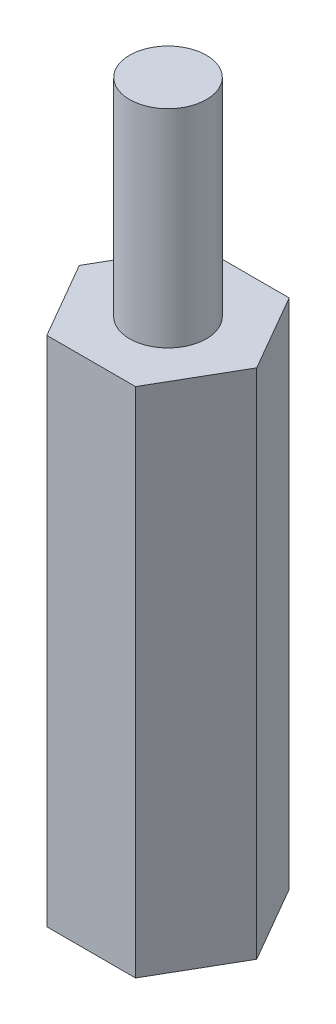
ISO-10303-21;
HEADER;
FILE_DESCRIPTION(('STEP AP214'),'2;1');
FILE_NAME('part.step','',(''),(''),'','','');
FILE_SCHEMA(('AUTOMOTIVE_DESIGN { 1 0 10303 214 1 1 1 1 }'));
ENDSEC;
DATA;
#1=APPLICATION_CONTEXT('core data for automotive mechanical design processes');
#2=APPLICATION_PROTOCOL_DEFINITION('international standard','automotive_design',2000,#1);
#3=PRODUCT_CONTEXT('',#1,'mechanical');
#4=PRODUCT('Part','Part','',(#3));
#5=PRODUCT_RELATED_PRODUCT_CATEGORY('part','',(#4));
#6=PRODUCT_DEFINITION_FORMATION('','',#4);
#7=PRODUCT_DEFINITION_CONTEXT('part definition',#1,'design');
#8=PRODUCT_DEFINITION('design','',#6,#7);
#9=PRODUCT_DEFINITION_SHAPE('','',#8);
#10=(LENGTH_UNIT() NAMED_UNIT(*) SI_UNIT(.MILLI.,.METRE.));
#11=(NAMED_UNIT(*) PLANE_ANGLE_UNIT() SI_UNIT($,.RADIAN.));
#12=(NAMED_UNIT(*) SI_UNIT($,.STERADIAN.) SOLID_ANGLE_UNIT());
#13=UNCERTAINTY_MEASURE_WITH_UNIT(LENGTH_MEASURE(1.E-05),#10,'distance_accuracy_value','');
#14=(GEOMETRIC_REPRESENTATION_CONTEXT(3) GLOBAL_UNCERTAINTY_ASSIGNED_CONTEXT((#13)) GLOBAL_UNIT_ASSIGNED_CONTEXT((#10,
#11,#12)) REPRESENTATION_CONTEXT('',''));
#15=CARTESIAN_POINT('',(0.,0.,0.));
#16=DIRECTION('',(0.,0.,1.));
#17=DIRECTION('',(1.,0.,0.));
#18=AXIS2_PLACEMENT_3D('',#15,#16,#17);
#19=CARTESIAN_POINT('',(-1.73205080756888,20.,-3.));
#20=DIRECTION('',(0.866025403784439,0.,0.5));
#21=DIRECTION('',(0.5,0.,-0.866025403784439));
#22=AXIS2_PLACEMENT_3D('',#19,#20,#21);
#23=PLANE('',#22);
#24=DIRECTION('',(-0.5,0.,0.866025403784439));
#25=VECTOR('',#24,1.);
#26=CARTESIAN_POINT('',(-1.73205080756888,0.,-3.));
#27=LINE('',#26,#25);
#28=CARTESIAN_POINT('',(-1.73205080756888,0.,-3.));
#29=VERTEX_POINT('',#28);
#30=CARTESIAN_POINT('',(-3.46410161513775,0.,0.));
#31=VERTEX_POINT('',#30);
#32=EDGE_CURVE('E134',#29,#31,#27,.T.);
#33=ORIENTED_EDGE('',*,*,#32,.T.);
#34=DIRECTION('',(0.,-1.,0.));
#35=VECTOR('',#34,1.);
#36=CARTESIAN_POINT('',(-3.46410161513775,20.,0.));
#37=LINE('',#36,#35);
#38=CARTESIAN_POINT('',(-3.46410161513775,20.,0.));
#39=VERTEX_POINT('',#38);
#40=EDGE_CURVE('E46',#39,#31,#37,.T.);
#41=ORIENTED_EDGE('',*,*,#40,.F.);
#42=DIRECTION('',(-0.5,0.,0.866025403784439));
#43=VECTOR('',#42,1.);
#44=CARTESIAN_POINT('',(-1.73205080756888,20.,-3.));
#45=LINE('',#44,#43);
#46=CARTESIAN_POINT('',(-1.73205080756888,20.,-3.));
#47=VERTEX_POINT('',#46);
#48=EDGE_CURVE('E151',#47,#39,#45,.T.);
#49=ORIENTED_EDGE('',*,*,#48,.F.);
#50=DIRECTION('',(0.,-1.,0.));
#51=VECTOR('',#50,1.);
#52=CARTESIAN_POINT('',(-1.73205080756888,20.,-3.));
#53=LINE('',#52,#51);
#54=EDGE_CURVE('E130',#47,#29,#53,.T.);
#55=ORIENTED_EDGE('',*,*,#54,.T.);
#56=EDGE_LOOP('',(#33,#41,#49,#55));
#57=FACE_BOUND('',#56,.T.);
#58=ADVANCED_FACE('F43',(#57),#23,.F.);
#59=CARTESIAN_POINT('',(-3.46410161513775,20.,0.));
#60=DIRECTION('',(0.866025403784439,0.,-0.5));
#61=DIRECTION('',(-0.5,0.,-0.866025403784439));
#62=AXIS2_PLACEMENT_3D('',#59,#60,#61);
#63=PLANE('',#62);
#64=DIRECTION('',(0.5,0.,0.866025403784439));
#65=VECTOR('',#64,1.);
#66=CARTESIAN_POINT('',(-3.46410161513775,0.,0.));
#67=LINE('',#66,#65);
#68=CARTESIAN_POINT('',(-1.73205080756888,0.,3.));
#69=VERTEX_POINT('',#68);
#70=EDGE_CURVE('E138',#31,#69,#67,.T.);
#71=ORIENTED_EDGE('',*,*,#70,.T.);
#72=DIRECTION('',(0.,-1.,0.));
#73=VECTOR('',#72,1.);
#74=CARTESIAN_POINT('',(-1.73205080756888,20.,3.));
#75=LINE('',#74,#73);
#76=CARTESIAN_POINT('',(-1.73205080756888,20.,3.));
#77=VERTEX_POINT('',#76);
#78=EDGE_CURVE('E157',#77,#69,#75,.T.);
#79=ORIENTED_EDGE('',*,*,#78,.F.);
#80=DIRECTION('',(0.5,0.,0.866025403784439));
#81=VECTOR('',#80,1.);
#82=CARTESIAN_POINT('',(-3.46410161513775,20.,0.));
#83=LINE('',#82,#81);
#84=EDGE_CURVE('E99',#39,#77,#83,.T.);
#85=ORIENTED_EDGE('',*,*,#84,.F.);
#86=ORIENTED_EDGE('',*,*,#40,.T.);
#87=EDGE_LOOP('',(#71,#79,#85,#86));
#88=FACE_BOUND('',#87,.T.);
#89=ADVANCED_FACE('F164',(#88),#63,.F.);
#90=CARTESIAN_POINT('',(-1.73205080756888,20.,3.));
#91=DIRECTION('',(0.,0.,-1.));
#92=DIRECTION('',(-1.,0.,0.));
#93=AXIS2_PLACEMENT_3D('',#90,#91,#92);
#94=PLANE('',#93);
#95=DIRECTION('',(1.,0.,0.));
#96=VECTOR('',#95,1.);
#97=CARTESIAN_POINT('',(-1.73205080756888,0.,3.));
#98=LINE('',#97,#96);
#99=CARTESIAN_POINT('',(1.73205080756888,0.,3.));
#100=VERTEX_POINT('',#99);
#101=EDGE_CURVE('E142',#69,#100,#98,.T.);
#102=ORIENTED_EDGE('',*,*,#101,.T.);
#103=DIRECTION('',(0.,-1.,0.));
#104=VECTOR('',#103,1.);
#105=CARTESIAN_POINT('',(1.73205080756888,20.,3.));
#106=LINE('',#105,#104);
#107=CARTESIAN_POINT('',(1.73205080756888,20.,3.));
#108=VERTEX_POINT('',#107);
#109=EDGE_CURVE('E123',#108,#100,#106,.T.);
#110=ORIENTED_EDGE('',*,*,#109,.F.);
#111=DIRECTION('',(1.,0.,0.));
#112=VECTOR('',#111,1.);
#113=CARTESIAN_POINT('',(-1.73205080756888,20.,3.));
#114=LINE('',#113,#112);
#115=EDGE_CURVE('E112',#77,#108,#114,.T.);
#116=ORIENTED_EDGE('',*,*,#115,.F.);
#117=ORIENTED_EDGE('',*,*,#78,.T.);
#118=EDGE_LOOP('',(#102,#110,#116,#117));
#119=FACE_BOUND('',#118,.T.);
#120=ADVANCED_FACE('F170',(#119),#94,.F.);
#121=CARTESIAN_POINT('',(1.73205080756888,20.,3.));
#122=DIRECTION('',(-0.866025403784439,0.,-0.5));
#123=DIRECTION('',(-0.5,0.,0.866025403784439));
#124=AXIS2_PLACEMENT_3D('',#121,#122,#123);
#125=PLANE('',#124);
#126=DIRECTION('',(0.5,0.,-0.866025403784439));
#127=VECTOR('',#126,1.);
#128=CARTESIAN_POINT('',(1.73205080756888,0.,3.));
#129=LINE('',#128,#127);
#130=CARTESIAN_POINT('',(3.46410161513775,0.,0.));
#131=VERTEX_POINT('',#130);
#132=EDGE_CURVE('E121',#100,#131,#129,.T.);
#133=ORIENTED_EDGE('',*,*,#132,.T.);
#134=DIRECTION('',(0.,-1.,0.));
#135=VECTOR('',#134,1.);
#136=CARTESIAN_POINT('',(3.46410161513775,20.,0.));
#137=LINE('',#136,#135);
#138=CARTESIAN_POINT('',(3.46410161513775,20.,0.));
#139=VERTEX_POINT('',#138);
#140=EDGE_CURVE('E118',#139,#131,#137,.T.);
#141=ORIENTED_EDGE('',*,*,#140,.F.);
#142=DIRECTION('',(0.5,0.,-0.866025403784439));
#143=VECTOR('',#142,1.);
#144=CARTESIAN_POINT('',(1.73205080756888,20.,3.));
#145=LINE('',#144,#143);
#146=EDGE_CURVE('E106',#108,#139,#145,.T.);
#147=ORIENTED_EDGE('',*,*,#146,.F.);
#148=ORIENTED_EDGE('',*,*,#109,.T.);
#149=EDGE_LOOP('',(#133,#141,#147,#148));
#150=FACE_BOUND('',#149,.T.);
#151=ADVANCED_FACE('F119',(#150),#125,.F.);
#152=CARTESIAN_POINT('',(3.46410161513775,20.,0.));
#153=DIRECTION('',(-0.866025403784439,0.,0.5));
#154=DIRECTION('',(0.5,0.,0.866025403784439));
#155=AXIS2_PLACEMENT_3D('',#152,#153,#154);
#156=PLANE('',#155);
#157=DIRECTION('',(-0.5,0.,-0.866025403784439));
#158=VECTOR('',#157,1.);
#159=CARTESIAN_POINT('',(3.46410161513775,0.,0.));
#160=LINE('',#159,#158);
#161=CARTESIAN_POINT('',(1.73205080756888,0.,-3.));
#162=VERTEX_POINT('',#161);
#163=EDGE_CURVE('E84',#131,#162,#160,.T.);
#164=ORIENTED_EDGE('',*,*,#163,.T.);
#165=DIRECTION('',(0.,-1.,0.));
#166=VECTOR('',#165,1.);
#167=CARTESIAN_POINT('',(1.73205080756888,20.,-3.));
#168=LINE('',#167,#166);
#169=CARTESIAN_POINT('',(1.73205080756888,20.,-3.));
#170=VERTEX_POINT('',#169);
#171=EDGE_CURVE('E124',#170,#162,#168,.T.);
#172=ORIENTED_EDGE('',*,*,#171,.F.);
#173=DIRECTION('',(-0.5,0.,-0.866025403784439));
#174=VECTOR('',#173,1.);
#175=CARTESIAN_POINT('',(3.46410161513775,20.,0.));
#176=LINE('',#175,#174);
#177=EDGE_CURVE('E110',#139,#170,#176,.T.);
#178=ORIENTED_EDGE('',*,*,#177,.F.);
#179=ORIENTED_EDGE('',*,*,#140,.T.);
#180=EDGE_LOOP('',(#164,#172,#178,#179));
#181=FACE_BOUND('',#180,.T.);
#182=ADVANCED_FACE('F126',(#181),#156,.F.);
#183=CARTESIAN_POINT('',(1.73205080756888,20.,-3.));
#184=DIRECTION('',(0.,0.,1.));
#185=DIRECTION('',(1.,0.,0.));
#186=AXIS2_PLACEMENT_3D('',#183,#184,#185);
#187=PLANE('',#186);
#188=DIRECTION('',(-1.,0.,0.));
#189=VECTOR('',#188,1.);
#190=CARTESIAN_POINT('',(1.73205080756888,0.,-3.));
#191=LINE('',#190,#189);
#192=EDGE_CURVE('E90',#162,#29,#191,.T.);
#193=ORIENTED_EDGE('',*,*,#192,.T.);
#194=ORIENTED_EDGE('',*,*,#54,.F.);
#195=DIRECTION('',(-1.,0.,0.));
#196=VECTOR('',#195,1.);
#197=CARTESIAN_POINT('',(1.73205080756888,20.,-3.));
#198=LINE('',#197,#196);
#199=EDGE_CURVE('E61',#170,#47,#198,.T.);
#200=ORIENTED_EDGE('',*,*,#199,.F.);
#201=ORIENTED_EDGE('',*,*,#171,.T.);
#202=EDGE_LOOP('',(#193,#194,#200,#201));
#203=FACE_BOUND('',#202,.T.);
#204=ADVANCED_FACE('F207',(#203),#187,.F.);
#205=CARTESIAN_POINT('',(0.,20.,0.));
#206=DIRECTION('',(0.,1.,0.));
#207=DIRECTION('',(0.,0.,1.));
#208=AXIS2_PLACEMENT_3D('',#205,#206,#207);
#209=PLANE('',#208);
#210=CARTESIAN_POINT('',(0.,20.,0.));
#211=DIRECTION('',(0.,1.,0.));
#212=DIRECTION('',(0.,0.,1.));
#213=AXIS2_PLACEMENT_3D('',#210,#211,#212);
#214=CIRCLE('',#213,1.5);
#215=CARTESIAN_POINT('',(0.,20.,1.5));
#216=VERTEX_POINT('',#215);
#217=EDGE_CURVE('E11',#216,#216,#214,.T.);
#218=ORIENTED_EDGE('',*,*,#217,.F.);
#219=EDGE_LOOP('',(#218));
#220=FACE_BOUND('',#219,.T.);
#221=ORIENTED_EDGE('',*,*,#48,.T.);
#222=ORIENTED_EDGE('',*,*,#84,.T.);
#223=ORIENTED_EDGE('',*,*,#115,.T.);
#224=ORIENTED_EDGE('',*,*,#146,.T.);
#225=ORIENTED_EDGE('',*,*,#177,.T.);
#226=ORIENTED_EDGE('',*,*,#199,.T.);
#227=EDGE_LOOP('',(#221,#222,#223,#224,#225,#226));
#228=FACE_BOUND('',#227,.T.);
#229=ADVANCED_FACE('F108',(#220,#228),#209,.T.);
#230=CARTESIAN_POINT('',(0.,0.,0.));
#231=DIRECTION('',(0.,1.,0.));
#232=DIRECTION('',(0.,0.,1.));
#233=AXIS2_PLACEMENT_3D('',#230,#231,#232);
#234=PLANE('',#233);
#235=CARTESIAN_POINT('',(0.,0.,0.));
#236=DIRECTION('',(0.,-1.,0.));
#237=DIRECTION('',(0.,0.,-1.));
#238=AXIS2_PLACEMENT_3D('',#235,#236,#237);
#239=CIRCLE('',#238,1.5);
#240=CARTESIAN_POINT('',(0.,0.,-1.5));
#241=VERTEX_POINT('',#240);
#242=EDGE_CURVE('E181',#241,#241,#239,.T.);
#243=ORIENTED_EDGE('',*,*,#242,.F.);
#244=EDGE_LOOP('',(#243));
#245=FACE_BOUND('',#244,.T.);
#246=ORIENTED_EDGE('',*,*,#32,.F.);
#247=ORIENTED_EDGE('',*,*,#192,.F.);
#248=ORIENTED_EDGE('',*,*,#163,.F.);
#249=ORIENTED_EDGE('',*,*,#132,.F.);
#250=ORIENTED_EDGE('',*,*,#101,.F.);
#251=ORIENTED_EDGE('',*,*,#70,.F.);
#252=EDGE_LOOP('',(#246,#247,#248,#249,#250,#251));
#253=FACE_BOUND('',#252,.T.);
#254=ADVANCED_FACE('F169',(#245,#253),#234,.F.);
#255=CARTESIAN_POINT('',(0.,28.0916054709663,0.));
#256=DIRECTION('',(0.,-1.,0.));
#257=DIRECTION('',(0.,0.,-1.));
#258=AXIS2_PLACEMENT_3D('',#255,#256,#257);
#259=CYLINDRICAL_SURFACE('',#258,1.5);
#260=CARTESIAN_POINT('',(0.,28.0916054709663,0.));
#261=DIRECTION('',(0.,1.,0.));
#262=DIRECTION('',(0.,0.,1.));
#263=AXIS2_PLACEMENT_3D('',#260,#261,#262);
#264=CIRCLE('',#263,1.5);
#265=CARTESIAN_POINT('',(0.,28.0916054709663,1.5));
#266=VERTEX_POINT('',#265);
#267=EDGE_CURVE('E139',#266,#266,#264,.T.);
#268=ORIENTED_EDGE('',*,*,#267,.F.);
#269=EDGE_LOOP('',(#268));
#270=FACE_BOUND('',#269,.T.);
#271=ORIENTED_EDGE('',*,*,#217,.T.);
#272=EDGE_LOOP('',(#271));
#273=FACE_BOUND('',#272,.T.);
#274=ADVANCED_FACE('F199',(#270,#273),#259,.T.);
#275=CARTESIAN_POINT('',(0.,28.0916054709663,0.));
#276=DIRECTION('',(0.,1.,0.));
#277=DIRECTION('',(0.,0.,1.));
#278=AXIS2_PLACEMENT_3D('',#275,#276,#277);
#279=PLANE('',#278);
#280=ORIENTED_EDGE('',*,*,#267,.T.);
#281=EDGE_LOOP('',(#280));
#282=FACE_BOUND('',#281,.T.);
#283=ADVANCED_FACE('F194',(#282),#279,.T.);
#284=CARTESIAN_POINT('',(0.,4.,0.));
#285=DIRECTION('',(0.,-1.,0.));
#286=DIRECTION('',(0.,0.,-1.));
#287=AXIS2_PLACEMENT_3D('',#284,#285,#286);
#288=CYLINDRICAL_SURFACE('',#287,1.5);
#289=CARTESIAN_POINT('',(0.,4.,0.));
#290=DIRECTION('',(0.,-1.,0.));
#291=DIRECTION('',(0.,0.,-1.));
#292=AXIS2_PLACEMENT_3D('',#289,#290,#291);
#293=CIRCLE('',#292,1.5);
#294=CARTESIAN_POINT('',(0.,4.,-1.5));
#295=VERTEX_POINT('',#294);
#296=EDGE_CURVE('E180',#295,#295,#293,.T.);
#297=ORIENTED_EDGE('',*,*,#296,.F.);
#298=EDGE_LOOP('',(#297));
#299=FACE_BOUND('',#298,.T.);
#300=ORIENTED_EDGE('',*,*,#242,.T.);
#301=EDGE_LOOP('',(#300));
#302=FACE_BOUND('',#301,.T.);
#303=ADVANCED_FACE('F191',(#299,#302),#288,.F.);
#304=CARTESIAN_POINT('',(0.,4.,0.));
#305=DIRECTION('',(0.,-1.,0.));
#306=DIRECTION('',(0.,0.,-1.));
#307=AXIS2_PLACEMENT_3D('',#304,#305,#306);
#308=PLANE('',#307);
#309=ORIENTED_EDGE('',*,*,#296,.T.);
#310=EDGE_LOOP('',(#309));
#311=FACE_BOUND('',#310,.T.);
#312=ADVANCED_FACE('F189',(#311),#308,.T.);
#313=CLOSED_SHELL('',(#58,#89,#120,#151,#182,#204,#229,#254,#274,#283,#303,#312));
#314=MANIFOLD_SOLID_BREP('B2',#313);
#315=ADVANCED_BREP_SHAPE_REPRESENTATION('',(#18,#314),#14);
#316=SHAPE_DEFINITION_REPRESENTATION(#9,#315);
ENDSEC;
END-ISO-10303-21;
